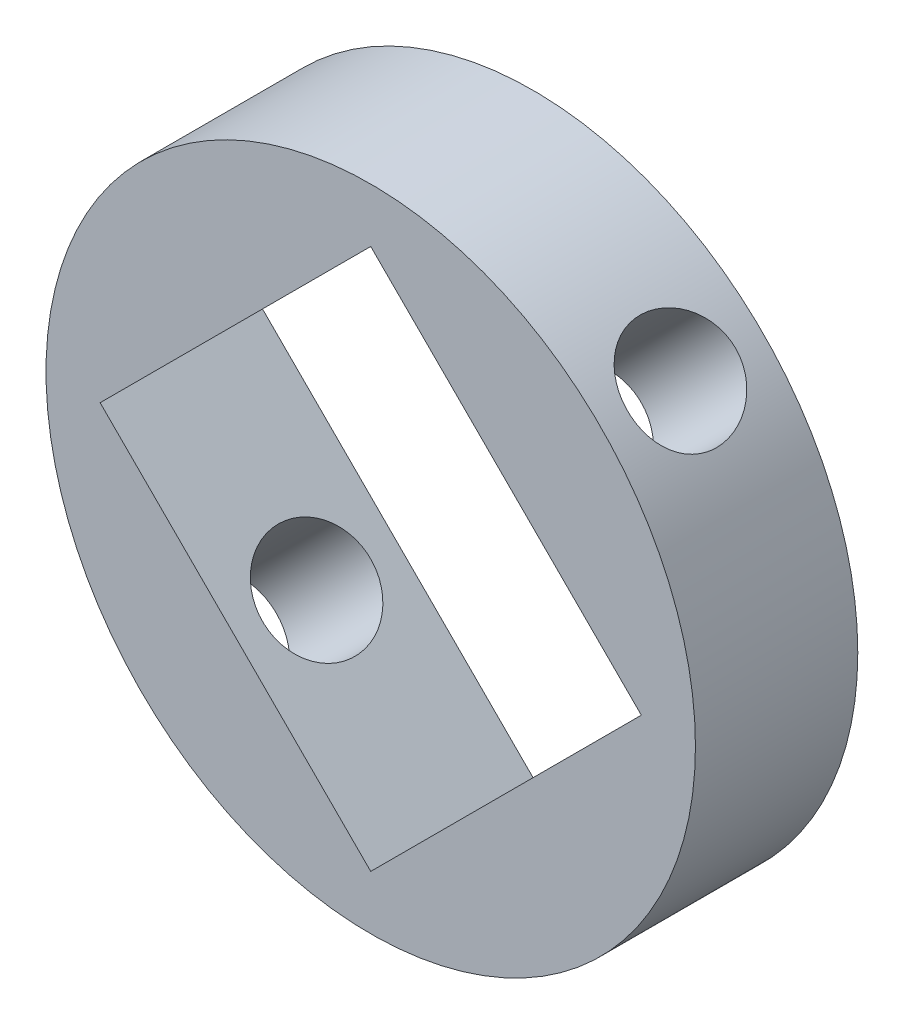
ISO-10303-21;
HEADER;
FILE_DESCRIPTION(('STEP AP214'),'2;1');
FILE_NAME('part.step','',(''),(''),'','','');
FILE_SCHEMA(('AUTOMOTIVE_DESIGN { 1 0 10303 214 1 1 1 1 }'));
ENDSEC;
DATA;
#1=APPLICATION_CONTEXT('core data for automotive mechanical design processes');
#2=APPLICATION_PROTOCOL_DEFINITION('international standard','automotive_design',2000,#1);
#3=PRODUCT_CONTEXT('',#1,'mechanical');
#4=PRODUCT('Part','Part','',(#3));
#5=PRODUCT_RELATED_PRODUCT_CATEGORY('part','',(#4));
#6=PRODUCT_DEFINITION_FORMATION('','',#4);
#7=PRODUCT_DEFINITION_CONTEXT('part definition',#1,'design');
#8=PRODUCT_DEFINITION('design','',#6,#7);
#9=PRODUCT_DEFINITION_SHAPE('','',#8);
#10=(LENGTH_UNIT() NAMED_UNIT(*) SI_UNIT(.MILLI.,.METRE.));
#11=(NAMED_UNIT(*) PLANE_ANGLE_UNIT() SI_UNIT($,.RADIAN.));
#12=(NAMED_UNIT(*) SI_UNIT($,.STERADIAN.) SOLID_ANGLE_UNIT());
#13=UNCERTAINTY_MEASURE_WITH_UNIT(LENGTH_MEASURE(1.E-05),#10,'distance_accuracy_value','');
#14=(GEOMETRIC_REPRESENTATION_CONTEXT(3) GLOBAL_UNCERTAINTY_ASSIGNED_CONTEXT((#13)) GLOBAL_UNIT_ASSIGNED_CONTEXT((#10,
#11,#12)) REPRESENTATION_CONTEXT('',''));
#15=CARTESIAN_POINT('',(0.,0.,0.));
#16=DIRECTION('',(0.,0.,1.));
#17=DIRECTION('',(1.,0.,0.));
#18=AXIS2_PLACEMENT_3D('',#15,#16,#17);
#19=CARTESIAN_POINT('',(0.,0.,-6.));
#20=DIRECTION('',(0.,0.,1.));
#21=DIRECTION('',(1.,0.,0.));
#22=AXIS2_PLACEMENT_3D('',#19,#20,#21);
#23=CYLINDRICAL_SURFACE('',#22,12.);
#24=CARTESIAN_POINT('',(-9.78081382771385,-6.95238670296766,-3.));
#25=CARTESIAN_POINT('',(-9.78081208219916,-6.9523912949175,-3.11150059852945));
#26=CARTESIAN_POINT('',(-9.77532477563483,-6.96012884174453,-3.22306208485718));
#27=CARTESIAN_POINT('',(-9.75343609129839,-6.99076715015903,-3.44305483461054));
#28=CARTESIAN_POINT('',(-9.73702464846325,-7.01368189531427,-3.55148311500645));
#29=CARTESIAN_POINT('',(-9.69352074864224,-7.07368498376973,-3.76199382667329));
#30=CARTESIAN_POINT('',(-9.66643721792504,-7.11076148120935,-3.8640814789298));
#31=CARTESIAN_POINT('',(-9.60196093123551,-7.19758687805691,-4.05918476377422));
#32=CARTESIAN_POINT('',(-9.5645693353819,-7.24733435136498,-4.15220141566187));
#33=CARTESIAN_POINT('',(-9.47962750995276,-7.3580950038496,-4.32745027979565));
#34=CARTESIAN_POINT('',(-9.43199056540401,-7.41920370348536,-4.40958010510897));
#35=CARTESIAN_POINT('',(-9.32750031541899,-7.55014838330019,-4.55983464548945));
#36=CARTESIAN_POINT('',(-9.27064646409821,-7.6199848803394,-4.62795853049233));
#37=CARTESIAN_POINT('',(-9.14836665129303,-7.76637128374913,-4.74865165377542));
#38=CARTESIAN_POINT('',(-9.08289154225726,-7.84295877892818,-4.80112560618544));
#39=CARTESIAN_POINT('',(-8.94500429751818,-7.99986204296698,-4.88841685642444));
#40=CARTESIAN_POINT('',(-8.87259261323184,-8.08017756903963,-4.9232353023079));
#41=CARTESIAN_POINT('',(-8.72327149668217,-8.24114490682918,-4.97391402798712));
#42=CARTESIAN_POINT('',(-8.64640974996163,-8.32178677157888,-4.98994633280375));
#43=CARTESIAN_POINT('',(-8.48965190449461,-8.48164713269601,-5.00313260332208));
#44=CARTESIAN_POINT('',(-8.40975601236223,-8.56086572544378,-5.00028785219779));
#45=CARTESIAN_POINT('',(-8.25007299449866,-8.7148426117715,-4.97593491877743));
#46=CARTESIAN_POINT('',(-8.17029262934672,-8.78963731138361,-4.95461186927268));
#47=CARTESIAN_POINT('',(-8.0125028835597,-8.93371252405611,-4.89419914060281));
#48=CARTESIAN_POINT('',(-7.93449355693859,-9.00299286909817,-4.8551089203284));
#49=CARTESIAN_POINT('',(-7.78240073684569,-9.13479183769391,-4.76008748774774));
#50=CARTESIAN_POINT('',(-7.70833685253816,-9.19727805127556,-4.70407999033405));
#51=CARTESIAN_POINT('',(-7.56699961407346,-9.31391034487499,-4.57686974189196));
#52=CARTESIAN_POINT('',(-7.49972681015929,-9.36805574927063,-4.50566576103135));
#53=CARTESIAN_POINT('',(-7.37355757613107,-9.46769251890809,-4.34905695470455));
#54=CARTESIAN_POINT('',(-7.31477267032224,-9.51307092337276,-4.26349032407921));
#55=CARTESIAN_POINT('',(-7.20876979175118,-9.59364816603106,-4.08113032782734));
#56=CARTESIAN_POINT('',(-7.16155192568626,-9.62884691032546,-3.98433685865374));
#57=CARTESIAN_POINT('',(-7.08051086152871,-9.68859721659945,-3.78208668649802));
#58=CARTESIAN_POINT('',(-7.04670272563001,-9.71313680883813,-3.67662040152633));
#59=CARTESIAN_POINT('',(-6.99398299947651,-9.75116755564915,-3.46012074215397));
#60=CARTESIAN_POINT('',(-6.97507009757402,-9.76465968304566,-3.34908785885406));
#61=CARTESIAN_POINT('',(-6.95309847755466,-9.78031716798892,-3.12602707507029));
#62=CARTESIAN_POINT('',(-6.94985310651861,-9.78261587958768,-3.01402689623832));
#63=CARTESIAN_POINT('',(-6.95885146200897,-9.7762168375793,-2.79097066264734));
#64=CARTESIAN_POINT('',(-6.97109459027675,-9.76751950870511,-2.67991457158882));
#65=CARTESIAN_POINT('',(-7.01041193174621,-9.73933763191342,-2.46261779264731));
#66=CARTESIAN_POINT('',(-7.03739183927021,-9.71992166784032,-2.35635108809759));
#67=CARTESIAN_POINT('',(-7.10500188884439,-9.67060951759546,-2.15082386697641));
#68=CARTESIAN_POINT('',(-7.14563284747928,-9.64071270447092,-2.05156376995928));
#69=CARTESIAN_POINT('',(-7.2393788045817,-9.57051942215204,-1.86186032447511));
#70=CARTESIAN_POINT('',(-7.2926054931684,-9.53012957499458,-1.77150674179515));
#71=CARTESIAN_POINT('',(-7.40932348526592,-9.43966969430281,-1.603109173844));
#72=CARTESIAN_POINT('',(-7.47281551072224,-9.3895989798793,-1.52506605511221));
#73=CARTESIAN_POINT('',(-7.60848941557836,-9.28000846717013,-1.38267848581704));
#74=CARTESIAN_POINT('',(-7.68075480044277,-9.22039581602192,-1.31848493897237));
#75=CARTESIAN_POINT('',(-7.83090081707363,-9.09322043004871,-1.2066757383961));
#76=CARTESIAN_POINT('',(-7.90878126710582,-9.02565795247895,-1.15905954842092));
#77=CARTESIAN_POINT('',(-8.06717452561509,-8.88436261739301,-1.08199153283611));
#78=CARTESIAN_POINT('',(-8.14767425021979,-8.81065820477249,-1.05246073941206));
#79=CARTESIAN_POINT('',(-8.30902799272891,-8.65865635788829,-1.01214752082894));
#80=CARTESIAN_POINT('',(-8.38988198093239,-8.58035930209636,-1.00136355301412));
#81=CARTESIAN_POINT('',(-8.54850897019756,-8.42231442222673,-0.998894494150241));
#82=CARTESIAN_POINT('',(-8.62630741866498,-8.34259563167646,-1.00697979684713));
#83=CARTESIAN_POINT('',(-8.77770326690977,-8.18315433789751,-1.04152313781554));
#84=CARTESIAN_POINT('',(-8.85130069020868,-8.10343183469212,-1.06798107320774));
#85=CARTESIAN_POINT('',(-8.99239931344898,-7.94656412078699,-1.13843053243492));
#86=CARTESIAN_POINT('',(-9.05990719856345,-7.86941614385954,-1.18240253456804));
#87=CARTESIAN_POINT('',(-9.18747123002217,-7.72010535263003,-1.28660634898447));
#88=CARTESIAN_POINT('',(-9.24752702292618,-7.64794277484898,-1.34683893204996));
#89=CARTESIAN_POINT('',(-9.35971181830622,-7.51024524378598,-1.4826680739684));
#90=CARTESIAN_POINT('',(-9.41174211232722,-7.44479570269398,-1.558432763801));
#91=CARTESIAN_POINT('',(-9.50618908272708,-7.32381558296903,-1.72282264632305));
#92=CARTESIAN_POINT('',(-9.54860350448475,-7.26828733121341,-1.81145084713003));
#93=CARTESIAN_POINT('',(-9.62343915169547,-7.16891394714817,-1.99979625799169));
#94=CARTESIAN_POINT('',(-9.65578756796697,-7.12515423385661,-2.09958747181239));
#95=CARTESIAN_POINT('',(-9.70959809408993,-7.05165211035939,-2.30688738867052));
#96=CARTESIAN_POINT('',(-9.73107108015901,-7.02189569795734,-2.41438825814189));
#97=CARTESIAN_POINT('',(-9.75822829629539,-6.98407749659542,-2.60192301558991));
#98=CARTESIAN_POINT('',(-9.76669103520373,-6.97221927123431,-2.68082144637009));
#99=CARTESIAN_POINT('',(-9.77798437687554,-6.9563722961696,-2.83980278786955));
#100=CARTESIAN_POINT('',(-9.78081508188405,-6.95238340360463,-2.91988567705936));
#101=CARTESIAN_POINT('',(-9.78081382771385,-6.95238670296766,-3.));
#102=B_SPLINE_CURVE_WITH_KNOTS('',3,(#24,#25,#26,#27,#28,#29,#30,#31,#32,#33,#34,#35,#36,#37,
#38,#39,#40,#41,#42,#43,#44,#45,#46,#47,#48,#49,#50,#51,#52,#53,#54,#55,#56,#57,#58,#59,#60,#61,
#62,#63,#64,#65,#66,#67,#68,#69,#70,#71,#72,#73,#74,#75,#76,#77,#78,#79,#80,#81,#82,#83,#84,#85,
#86,#87,#88,#89,#90,#91,#92,#93,#94,#95,#96,#97,#98,#99,#100,#101),.UNSPECIFIED.,.T.,.F.,(4,2,2,
2,2,2,2,2,2,2,2,2,2,2,2,2,2,2,2,2,2,2,2,2,2,2,2,2,2,2,2,2,2,2,2,2,2,2,4),(0.,0.334208831142193,
0.668726015970376,1.00296399830015,1.33716437924219,1.67431327324572,2.01148214267558,
2.35066384089148,2.68982348088891,3.02585253978053,3.36185875722154,3.69453696931735,
4.02722531399627,4.36143683311541,4.69567540981412,5.03396898769699,5.37226568596815,
5.71094129998883,6.04958708750462,6.38418833936329,6.71877666731181,7.05124851708394,
7.3837402583486,7.71929874210162,8.05488083544552,8.39395290428305,8.73301400381359,
9.07058387534117,9.40812596729881,9.74158221012734,10.0750365857506,10.4081203186597,
10.7412198431387,11.078135979706,11.4151310310545,11.7545098209466,12.0935485339556,
12.3336853643501,12.5738178352146),.UNSPECIFIED.);
#103=CARTESIAN_POINT('',(-9.78081382771385,-6.95238670296766,-3.));
#104=VERTEX_POINT('',#103);
#105=EDGE_CURVE('E143',#104,#104,#102,.T.);
#106=ORIENTED_EDGE('',*,*,#105,.F.);
#107=EDGE_LOOP('',(#106));
#108=FACE_BOUND('',#107,.T.);
#109=CARTESIAN_POINT('',(9.78081382771385,6.95238670296766,-3.));
#110=CARTESIAN_POINT('',(9.78081208219917,6.9523912949175,-3.11150059852945));
#111=CARTESIAN_POINT('',(9.77532477563483,6.96012884174453,-3.22306208485718));
#112=CARTESIAN_POINT('',(9.75343609129839,6.99076715015903,-3.44305483461054));
#113=CARTESIAN_POINT('',(9.73702464846325,7.01368189531427,-3.55148311500645));
#114=CARTESIAN_POINT('',(9.69352074864224,7.07368498376973,-3.76199382667328));
#115=CARTESIAN_POINT('',(9.66643721792504,7.11076148120935,-3.8640814789298));
#116=CARTESIAN_POINT('',(9.60196093123551,7.19758687805691,-4.05918476377422));
#117=CARTESIAN_POINT('',(9.5645693353819,7.24733435136498,-4.15220141566187));
#118=CARTESIAN_POINT('',(9.47962750995276,7.3580950038496,-4.32745027979565));
#119=CARTESIAN_POINT('',(9.43199056540401,7.41920370348536,-4.40958010510897));
#120=CARTESIAN_POINT('',(9.32750031541899,7.55014838330019,-4.55983464548945));
#121=CARTESIAN_POINT('',(9.27064646409821,7.6199848803394,-4.62795853049233));
#122=CARTESIAN_POINT('',(9.14836665129303,7.76637128374913,-4.74865165377542));
#123=CARTESIAN_POINT('',(9.08289154225726,7.84295877892818,-4.80112560618544));
#124=CARTESIAN_POINT('',(8.94500429751818,7.99986204296698,-4.88841685642444));
#125=CARTESIAN_POINT('',(8.87259261323184,8.08017756903963,-4.9232353023079));
#126=CARTESIAN_POINT('',(8.72327149668217,8.24114490682918,-4.97391402798712));
#127=CARTESIAN_POINT('',(8.64640974996163,8.32178677157887,-4.98994633280375));
#128=CARTESIAN_POINT('',(8.48965190449461,8.48164713269601,-5.00313260332208));
#129=CARTESIAN_POINT('',(8.40975601236223,8.56086572544378,-5.00028785219779));
#130=CARTESIAN_POINT('',(8.25007299449866,8.7148426117715,-4.97593491877743));
#131=CARTESIAN_POINT('',(8.17029262934672,8.78963731138361,-4.95461186927268));
#132=CARTESIAN_POINT('',(8.0125028835597,8.93371252405611,-4.89419914060281));
#133=CARTESIAN_POINT('',(7.93449355693859,9.00299286909817,-4.8551089203284));
#134=CARTESIAN_POINT('',(7.78240073684569,9.13479183769391,-4.76008748774775));
#135=CARTESIAN_POINT('',(7.70833685253817,9.19727805127556,-4.70407999033405));
#136=CARTESIAN_POINT('',(7.56699961407346,9.31391034487499,-4.57686974189196));
#137=CARTESIAN_POINT('',(7.49972681015929,9.36805574927063,-4.50566576103135));
#138=CARTESIAN_POINT('',(7.37355757613107,9.46769251890809,-4.34905695470455));
#139=CARTESIAN_POINT('',(7.31477267032224,9.51307092337276,-4.26349032407921));
#140=CARTESIAN_POINT('',(7.20876979175118,9.59364816603106,-4.08113032782734));
#141=CARTESIAN_POINT('',(7.16155192568626,9.62884691032546,-3.98433685865374));
#142=CARTESIAN_POINT('',(7.08051086152871,9.68859721659945,-3.78208668649802));
#143=CARTESIAN_POINT('',(7.04670272563001,9.71313680883813,-3.67662040152633));
#144=CARTESIAN_POINT('',(6.99398299947651,9.75116755564915,-3.46012074215397));
#145=CARTESIAN_POINT('',(6.97507009757402,9.76465968304566,-3.34908785885406));
#146=CARTESIAN_POINT('',(6.95309847755466,9.78031716798892,-3.1260270750703));
#147=CARTESIAN_POINT('',(6.94985310651861,9.78261587958768,-3.01402689623832));
#148=CARTESIAN_POINT('',(6.95885146200897,9.7762168375793,-2.79097066264735));
#149=CARTESIAN_POINT('',(6.97109459027675,9.76751950870511,-2.67991457158882));
#150=CARTESIAN_POINT('',(7.01041193174621,9.73933763191342,-2.46261779264731));
#151=CARTESIAN_POINT('',(7.03739183927021,9.71992166784032,-2.35635108809759));
#152=CARTESIAN_POINT('',(7.10500188884439,9.67060951759546,-2.15082386697641));
#153=CARTESIAN_POINT('',(7.14563284747929,9.64071270447092,-2.05156376995928));
#154=CARTESIAN_POINT('',(7.2393788045817,9.57051942215204,-1.86186032447511));
#155=CARTESIAN_POINT('',(7.2926054931684,9.53012957499458,-1.77150674179515));
#156=CARTESIAN_POINT('',(7.40932348526592,9.43966969430281,-1.603109173844));
#157=CARTESIAN_POINT('',(7.47281551072224,9.3895989798793,-1.52506605511221));
#158=CARTESIAN_POINT('',(7.60848941557836,9.28000846717013,-1.38267848581704));
#159=CARTESIAN_POINT('',(7.68075480044277,9.22039581602192,-1.31848493897237));
#160=CARTESIAN_POINT('',(7.83090081707363,9.09322043004871,-1.2066757383961));
#161=CARTESIAN_POINT('',(7.90878126710582,9.02565795247896,-1.15905954842092));
#162=CARTESIAN_POINT('',(8.06717452561509,8.88436261739301,-1.08199153283611));
#163=CARTESIAN_POINT('',(8.14767425021978,8.81065820477249,-1.05246073941206));
#164=CARTESIAN_POINT('',(8.3090279927289,8.65865635788829,-1.01214752082894));
#165=CARTESIAN_POINT('',(8.38988198093239,8.58035930209636,-1.00136355301412));
#166=CARTESIAN_POINT('',(8.54850897019755,8.42231442222673,-0.998894494150242));
#167=CARTESIAN_POINT('',(8.62630741866498,8.34259563167646,-1.00697979684713));
#168=CARTESIAN_POINT('',(8.77770326690977,8.18315433789751,-1.04152313781554));
#169=CARTESIAN_POINT('',(8.85130069020868,8.10343183469212,-1.06798107320774));
#170=CARTESIAN_POINT('',(8.99239931344898,7.94656412078699,-1.13843053243492));
#171=CARTESIAN_POINT('',(9.05990719856345,7.86941614385954,-1.18240253456804));
#172=CARTESIAN_POINT('',(9.18747123002217,7.72010535263003,-1.28660634898447));
#173=CARTESIAN_POINT('',(9.24752702292618,7.64794277484898,-1.34683893204996));
#174=CARTESIAN_POINT('',(9.35971181830622,7.51024524378598,-1.4826680739684));
#175=CARTESIAN_POINT('',(9.41174211232722,7.44479570269398,-1.558432763801));
#176=CARTESIAN_POINT('',(9.50618908272708,7.32381558296903,-1.72282264632305));
#177=CARTESIAN_POINT('',(9.54860350448475,7.26828733121341,-1.81145084713002));
#178=CARTESIAN_POINT('',(9.62343915169547,7.16891394714817,-1.99979625799169));
#179=CARTESIAN_POINT('',(9.65578756796697,7.12515423385661,-2.09958747181239));
#180=CARTESIAN_POINT('',(9.70959809408993,7.05165211035939,-2.30688738867052));
#181=CARTESIAN_POINT('',(9.73107108015901,7.02189569795734,-2.41438825814189));
#182=CARTESIAN_POINT('',(9.75822829629539,6.98407749659542,-2.60192301558991));
#183=CARTESIAN_POINT('',(9.76669103520373,6.97221927123431,-2.68082144637008));
#184=CARTESIAN_POINT('',(9.77798437687554,6.9563722961696,-2.83980278786955));
#185=CARTESIAN_POINT('',(9.78081508188405,6.95238340360464,-2.91988567705936));
#186=CARTESIAN_POINT('',(9.78081382771385,6.95238670296766,-3.));
#187=B_SPLINE_CURVE_WITH_KNOTS('',3,(#109,#110,#111,#112,#113,#114,#115,#116,#117,#118,#119,
#120,#121,#122,#123,#124,#125,#126,#127,#128,#129,#130,#131,#132,#133,#134,#135,#136,#137,#138,
#139,#140,#141,#142,#143,#144,#145,#146,#147,#148,#149,#150,#151,#152,#153,#154,#155,#156,#157,
#158,#159,#160,#161,#162,#163,#164,#165,#166,#167,#168,#169,#170,#171,#172,#173,#174,#175,#176,
#177,#178,#179,#180,#181,#182,#183,#184,#185,#186),.UNSPECIFIED.,.T.,.F.,(4,2,2,2,2,2,2,2,2,2,2,
2,2,2,2,2,2,2,2,2,2,2,2,2,2,2,2,2,2,2,2,2,2,2,2,2,2,2,4),(0.,0.334208831142193,
0.668726015970376,1.00296399830015,1.33716437924219,1.67431327324572,2.01148214267557,
2.35066384089148,2.6898234808889,3.02585253978052,3.36185875722153,3.69453696931734,
4.02722531399626,4.3614368331154,4.69567540981411,5.03396898769699,5.37226568596815,
5.71094129998883,6.04958708750461,6.38418833936328,6.71877666731181,7.05124851708393,
7.38374025834859,7.71929874210161,8.05488083544551,8.39395290428305,8.73301400381358,
9.07058387534117,9.4081259672988,9.74158221012733,10.0750365857506,10.4081203186597,
10.7412198431387,11.078135979706,11.4151310310545,11.7545098209466,12.0935485339556,
12.3336853643501,12.5738178352145),.UNSPECIFIED.);
#188=CARTESIAN_POINT('',(9.78081382771385,6.95238670296766,-3.));
#189=VERTEX_POINT('',#188);
#190=EDGE_CURVE('E147',#189,#189,#187,.T.);
#191=ORIENTED_EDGE('',*,*,#190,.F.);
#192=EDGE_LOOP('',(#191));
#193=FACE_BOUND('',#192,.T.);
#194=CARTESIAN_POINT('',(0.,0.,-6.));
#195=DIRECTION('',(0.,0.,1.));
#196=DIRECTION('',(1.,0.,0.));
#197=AXIS2_PLACEMENT_3D('',#194,#195,#196);
#198=CIRCLE('',#197,12.);
#199=CARTESIAN_POINT('',(12.,0.,-6.));
#200=VERTEX_POINT('',#199);
#201=EDGE_CURVE('E11',#200,#200,#198,.T.);
#202=ORIENTED_EDGE('',*,*,#201,.T.);
#203=EDGE_LOOP('',(#202));
#204=FACE_BOUND('',#203,.T.);
#205=CARTESIAN_POINT('',(0.,0.,0.));
#206=DIRECTION('',(0.,0.,1.));
#207=DIRECTION('',(1.,0.,0.));
#208=AXIS2_PLACEMENT_3D('',#205,#206,#207);
#209=CIRCLE('',#208,12.);
#210=CARTESIAN_POINT('',(12.,0.,0.));
#211=VERTEX_POINT('',#210);
#212=EDGE_CURVE('E43',#211,#211,#209,.T.);
#213=ORIENTED_EDGE('',*,*,#212,.F.);
#214=EDGE_LOOP('',(#213));
#215=FACE_BOUND('',#214,.T.);
#216=ADVANCED_FACE('F39',(#108,#193,#204,#215),#23,.T.);
#217=CARTESIAN_POINT('',(0.,0.,-6.));
#218=DIRECTION('',(0.,0.,1.));
#219=DIRECTION('',(1.,0.,0.));
#220=AXIS2_PLACEMENT_3D('',#217,#218,#219);
#221=PLANE('',#220);
#222=DIRECTION('',(0.707106781186548,-0.707106781186548,0.));
#223=VECTOR('',#222,1.);
#224=CARTESIAN_POINT('',(-5.,-5.,-6.));
#225=LINE('',#224,#223);
#226=CARTESIAN_POINT('',(-10.,0.,-6.));
#227=VERTEX_POINT('',#226);
#228=CARTESIAN_POINT('',(0.,-10.,-6.));
#229=VERTEX_POINT('',#228);
#230=EDGE_CURVE('E121',#227,#229,#225,.T.);
#231=ORIENTED_EDGE('',*,*,#230,.T.);
#232=DIRECTION('',(0.707106781186548,0.707106781186548,0.));
#233=VECTOR('',#232,1.);
#234=CARTESIAN_POINT('',(5.,-5.,-6.));
#235=LINE('',#234,#233);
#236=CARTESIAN_POINT('',(10.,0.,-6.));
#237=VERTEX_POINT('',#236);
#238=EDGE_CURVE('E125',#229,#237,#235,.T.);
#239=ORIENTED_EDGE('',*,*,#238,.T.);
#240=DIRECTION('',(-0.707106781186548,0.707106781186548,0.));
#241=VECTOR('',#240,1.);
#242=CARTESIAN_POINT('',(5.,5.,-6.));
#243=LINE('',#242,#241);
#244=CARTESIAN_POINT('',(0.,10.,-6.));
#245=VERTEX_POINT('',#244);
#246=EDGE_CURVE('E112',#237,#245,#243,.T.);
#247=ORIENTED_EDGE('',*,*,#246,.T.);
#248=DIRECTION('',(-0.707106781186548,-0.707106781186548,0.));
#249=VECTOR('',#248,1.);
#250=CARTESIAN_POINT('',(-5.,5.,-6.));
#251=LINE('',#250,#249);
#252=EDGE_CURVE('E87',#245,#227,#251,.T.);
#253=ORIENTED_EDGE('',*,*,#252,.T.);
#254=EDGE_LOOP('',(#231,#239,#247,#253));
#255=FACE_BOUND('',#254,.T.);
#256=ORIENTED_EDGE('',*,*,#201,.F.);
#257=EDGE_LOOP('',(#256));
#258=FACE_BOUND('',#257,.T.);
#259=ADVANCED_FACE('F134',(#255,#258),#221,.F.);
#260=CARTESIAN_POINT('',(0.,0.,0.));
#261=DIRECTION('',(0.,0.,1.));
#262=DIRECTION('',(1.,0.,0.));
#263=AXIS2_PLACEMENT_3D('',#260,#261,#262);
#264=PLANE('',#263);
#265=DIRECTION('',(0.707106781186548,0.707106781186548,0.));
#266=VECTOR('',#265,1.);
#267=CARTESIAN_POINT('',(0.,-10.,0.));
#268=LINE('',#267,#266);
#269=CARTESIAN_POINT('',(0.,-10.,0.));
#270=VERTEX_POINT('',#269);
#271=CARTESIAN_POINT('',(10.,0.,0.));
#272=VERTEX_POINT('',#271);
#273=EDGE_CURVE('E63',#270,#272,#268,.T.);
#274=ORIENTED_EDGE('',*,*,#273,.F.);
#275=DIRECTION('',(0.707106781186548,-0.707106781186548,0.));
#276=VECTOR('',#275,1.);
#277=CARTESIAN_POINT('',(-10.,0.,0.));
#278=LINE('',#277,#276);
#279=CARTESIAN_POINT('',(-10.,0.,0.));
#280=VERTEX_POINT('',#279);
#281=EDGE_CURVE('E102',#280,#270,#278,.T.);
#282=ORIENTED_EDGE('',*,*,#281,.F.);
#283=DIRECTION('',(-0.707106781186548,-0.707106781186548,0.));
#284=VECTOR('',#283,1.);
#285=CARTESIAN_POINT('',(0.,10.,0.));
#286=LINE('',#285,#284);
#287=CARTESIAN_POINT('',(0.,10.,0.));
#288=VERTEX_POINT('',#287);
#289=EDGE_CURVE('E84',#288,#280,#286,.T.);
#290=ORIENTED_EDGE('',*,*,#289,.F.);
#291=DIRECTION('',(-0.707106781186548,0.707106781186548,0.));
#292=VECTOR('',#291,1.);
#293=CARTESIAN_POINT('',(10.,0.,0.));
#294=LINE('',#293,#292);
#295=EDGE_CURVE('E94',#272,#288,#294,.T.);
#296=ORIENTED_EDGE('',*,*,#295,.F.);
#297=EDGE_LOOP('',(#274,#282,#290,#296));
#298=FACE_BOUND('',#297,.T.);
#299=ORIENTED_EDGE('',*,*,#212,.T.);
#300=EDGE_LOOP('',(#299));
#301=FACE_BOUND('',#300,.T.);
#302=ADVANCED_FACE('F99',(#298,#301),#264,.T.);
#303=CARTESIAN_POINT('',(0.,-10.,-10.));
#304=DIRECTION('',(0.707106781186548,-0.707106781186548,0.));
#305=DIRECTION('',(0.707106781186548,0.707106781186548,0.));
#306=AXIS2_PLACEMENT_3D('',#303,#304,#305);
#307=PLANE('',#306);
#308=DIRECTION('',(0.,0.,1.));
#309=VECTOR('',#308,1.);
#310=CARTESIAN_POINT('',(0.,-10.,-10.));
#311=LINE('',#310,#309);
#312=EDGE_CURVE('E109',#229,#270,#311,.T.);
#313=ORIENTED_EDGE('',*,*,#312,.T.);
#314=ORIENTED_EDGE('',*,*,#273,.T.);
#315=DIRECTION('',(0.,0.,1.));
#316=VECTOR('',#315,1.);
#317=CARTESIAN_POINT('',(10.,0.,-10.));
#318=LINE('',#317,#316);
#319=EDGE_CURVE('E91',#237,#272,#318,.T.);
#320=ORIENTED_EDGE('',*,*,#319,.F.);
#321=ORIENTED_EDGE('',*,*,#238,.F.);
#322=EDGE_LOOP('',(#313,#314,#320,#321));
#323=FACE_BOUND('',#322,.T.);
#324=ADVANCED_FACE('F173',(#323),#307,.F.);
#325=CARTESIAN_POINT('',(-10.,0.,-10.));
#326=DIRECTION('',(-0.707106781186548,-0.707106781186548,0.));
#327=DIRECTION('',(0.707106781186548,-0.707106781186548,0.));
#328=AXIS2_PLACEMENT_3D('',#325,#326,#327);
#329=PLANE('',#328);
#330=CARTESIAN_POINT('',(-5.,-5.,-3.));
#331=DIRECTION('',(0.707106781186548,0.707106781186547,0.));
#332=DIRECTION('',(-0.707106781186547,0.707106781186548,0.));
#333=AXIS2_PLACEMENT_3D('',#330,#331,#332);
#334=CIRCLE('',#333,2.);
#335=CARTESIAN_POINT('',(-6.4142135623731,-3.58578643762691,-3.));
#336=VERTEX_POINT('',#335);
#337=EDGE_CURVE('E239',#336,#336,#334,.T.);
#338=ORIENTED_EDGE('',*,*,#337,.F.);
#339=EDGE_LOOP('',(#338));
#340=FACE_BOUND('',#339,.T.);
#341=DIRECTION('',(0.,0.,1.));
#342=VECTOR('',#341,1.);
#343=CARTESIAN_POINT('',(-10.,0.,-10.));
#344=LINE('',#343,#342);
#345=EDGE_CURVE('E90',#227,#280,#344,.T.);
#346=ORIENTED_EDGE('',*,*,#345,.T.);
#347=ORIENTED_EDGE('',*,*,#281,.T.);
#348=ORIENTED_EDGE('',*,*,#312,.F.);
#349=ORIENTED_EDGE('',*,*,#230,.F.);
#350=EDGE_LOOP('',(#346,#347,#348,#349));
#351=FACE_BOUND('',#350,.T.);
#352=ADVANCED_FACE('F170',(#340,#351),#329,.F.);
#353=CARTESIAN_POINT('',(0.,10.,-10.));
#354=DIRECTION('',(-0.707106781186548,0.707106781186548,0.));
#355=DIRECTION('',(-0.707106781186548,-0.707106781186548,0.));
#356=AXIS2_PLACEMENT_3D('',#353,#354,#355);
#357=PLANE('',#356);
#358=DIRECTION('',(0.,0.,1.));
#359=VECTOR('',#358,1.);
#360=CARTESIAN_POINT('',(0.,10.,-10.));
#361=LINE('',#360,#359);
#362=EDGE_CURVE('E55',#245,#288,#361,.T.);
#363=ORIENTED_EDGE('',*,*,#362,.T.);
#364=ORIENTED_EDGE('',*,*,#289,.T.);
#365=ORIENTED_EDGE('',*,*,#345,.F.);
#366=ORIENTED_EDGE('',*,*,#252,.F.);
#367=EDGE_LOOP('',(#363,#364,#365,#366));
#368=FACE_BOUND('',#367,.T.);
#369=ADVANCED_FACE('F81',(#368),#357,.F.);
#370=CARTESIAN_POINT('',(10.,0.,-10.));
#371=DIRECTION('',(0.707106781186548,0.707106781186548,0.));
#372=DIRECTION('',(-0.707106781186548,0.707106781186548,0.));
#373=AXIS2_PLACEMENT_3D('',#370,#371,#372);
#374=PLANE('',#373);
#375=CARTESIAN_POINT('',(5.,5.,-3.));
#376=DIRECTION('',(-0.707106781186548,-0.707106781186547,0.));
#377=DIRECTION('',(0.707106781186547,-0.707106781186548,0.));
#378=AXIS2_PLACEMENT_3D('',#375,#376,#377);
#379=CIRCLE('',#378,2.);
#380=CARTESIAN_POINT('',(6.4142135623731,3.58578643762691,-3.));
#381=VERTEX_POINT('',#380);
#382=EDGE_CURVE('E152',#381,#381,#379,.T.);
#383=ORIENTED_EDGE('',*,*,#382,.F.);
#384=EDGE_LOOP('',(#383));
#385=FACE_BOUND('',#384,.T.);
#386=ORIENTED_EDGE('',*,*,#319,.T.);
#387=ORIENTED_EDGE('',*,*,#295,.T.);
#388=ORIENTED_EDGE('',*,*,#362,.F.);
#389=ORIENTED_EDGE('',*,*,#246,.F.);
#390=EDGE_LOOP('',(#386,#387,#388,#389));
#391=FACE_BOUND('',#390,.T.);
#392=ADVANCED_FACE('F95',(#385,#391),#374,.F.);
#393=CARTESIAN_POINT('',(12.778174593052,12.778174593052,-3.));
#394=DIRECTION('',(-0.707106781186548,-0.707106781186547,0.));
#395=DIRECTION('',(0.707106781186547,-0.707106781186548,0.));
#396=AXIS2_PLACEMENT_3D('',#393,#394,#395);
#397=CYLINDRICAL_SURFACE('',#396,2.);
#398=ORIENTED_EDGE('',*,*,#190,.T.);
#399=EDGE_LOOP('',(#398));
#400=FACE_BOUND('',#399,.T.);
#401=ORIENTED_EDGE('',*,*,#382,.T.);
#402=EDGE_LOOP('',(#401));
#403=FACE_BOUND('',#402,.T.);
#404=ADVANCED_FACE('F163',(#400,#403),#397,.F.);
#405=CARTESIAN_POINT('',(-12.778174593052,-12.778174593052,-3.));
#406=DIRECTION('',(0.707106781186548,0.707106781186547,0.));
#407=DIRECTION('',(-0.707106781186547,0.707106781186548,0.));
#408=AXIS2_PLACEMENT_3D('',#405,#406,#407);
#409=CYLINDRICAL_SURFACE('',#408,2.);
#410=ORIENTED_EDGE('',*,*,#105,.T.);
#411=EDGE_LOOP('',(#410));
#412=FACE_BOUND('',#411,.T.);
#413=ORIENTED_EDGE('',*,*,#337,.T.);
#414=EDGE_LOOP('',(#413));
#415=FACE_BOUND('',#414,.T.);
#416=ADVANCED_FACE('F168',(#412,#415),#409,.F.);
#417=CLOSED_SHELL('',(#216,#259,#302,#324,#352,#369,#392,#404,#416));
#418=MANIFOLD_SOLID_BREP('B2',#417);
#419=ADVANCED_BREP_SHAPE_REPRESENTATION('',(#18,#418),#14);
#420=SHAPE_DEFINITION_REPRESENTATION(#9,#419);
ENDSEC;
END-ISO-10303-21;
